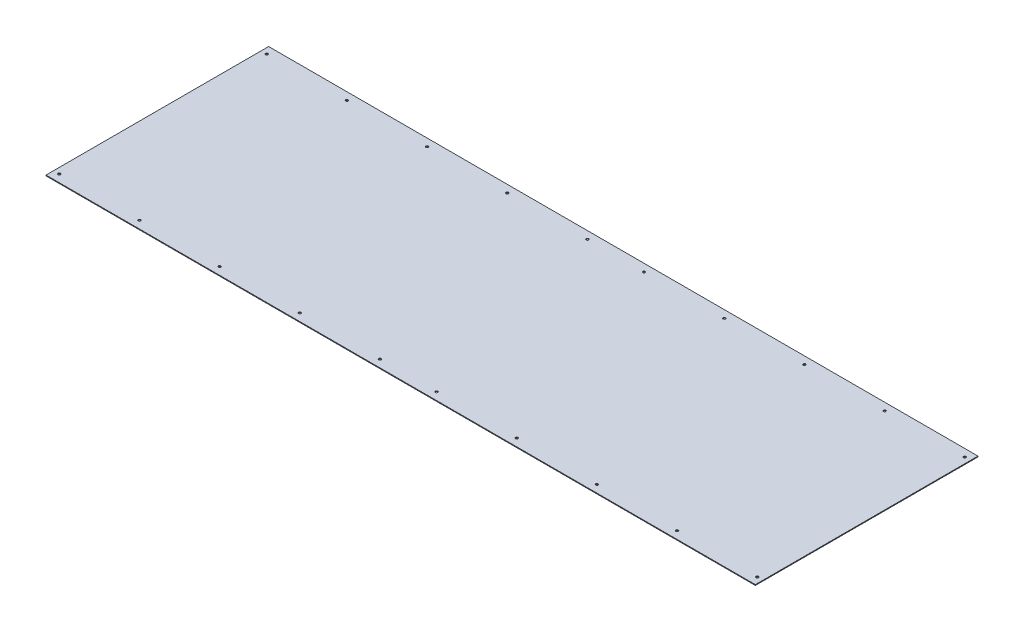
ISO-10303-21;
HEADER;
FILE_DESCRIPTION(('STEP AP214'),'2;1');
FILE_NAME('part.step','',(''),(''),'','','');
FILE_SCHEMA(('AUTOMOTIVE_DESIGN { 1 0 10303 214 1 1 1 1 }'));
ENDSEC;
DATA;
#1=APPLICATION_CONTEXT('core data for automotive mechanical design processes');
#2=APPLICATION_PROTOCOL_DEFINITION('international standard','automotive_design',2000,#1);
#3=PRODUCT_CONTEXT('',#1,'mechanical');
#4=PRODUCT('Part','Part','',(#3));
#5=PRODUCT_RELATED_PRODUCT_CATEGORY('part','',(#4));
#6=PRODUCT_DEFINITION_FORMATION('','',#4);
#7=PRODUCT_DEFINITION_CONTEXT('part definition',#1,'design');
#8=PRODUCT_DEFINITION('design','',#6,#7);
#9=PRODUCT_DEFINITION_SHAPE('','',#8);
#10=(LENGTH_UNIT() NAMED_UNIT(*) SI_UNIT(.MILLI.,.METRE.));
#11=(NAMED_UNIT(*) PLANE_ANGLE_UNIT() SI_UNIT($,.RADIAN.));
#12=(NAMED_UNIT(*) SI_UNIT($,.STERADIAN.) SOLID_ANGLE_UNIT());
#13=UNCERTAINTY_MEASURE_WITH_UNIT(LENGTH_MEASURE(1.E-05),#10,'distance_accuracy_value','');
#14=(GEOMETRIC_REPRESENTATION_CONTEXT(3) GLOBAL_UNCERTAINTY_ASSIGNED_CONTEXT((#13)) GLOBAL_UNIT_ASSIGNED_CONTEXT((#10,
#11,#12)) REPRESENTATION_CONTEXT('',''));
#15=CARTESIAN_POINT('',(0.,0.,0.));
#16=DIRECTION('',(0.,0.,1.));
#17=DIRECTION('',(1.,0.,0.));
#18=AXIS2_PLACEMENT_3D('',#15,#16,#17);
#19=CARTESIAN_POINT('',(-940.,2.,295.));
#20=DIRECTION('',(1.,0.,0.));
#21=DIRECTION('',(0.,0.,-1.));
#22=AXIS2_PLACEMENT_3D('',#19,#20,#21);
#23=PLANE('',#22);
#24=DIRECTION('',(0.,0.,1.));
#25=VECTOR('',#24,1.);
#26=CARTESIAN_POINT('',(-940.,0.,295.));
#27=LINE('',#26,#25);
#28=CARTESIAN_POINT('',(-940.,0.,-295.));
#29=VERTEX_POINT('',#28);
#30=CARTESIAN_POINT('',(-940.,0.,295.));
#31=VERTEX_POINT('',#30);
#32=EDGE_CURVE('E104',#29,#31,#27,.T.);
#33=ORIENTED_EDGE('',*,*,#32,.T.);
#34=DIRECTION('',(0.,-1.,0.));
#35=VECTOR('',#34,1.);
#36=CARTESIAN_POINT('',(-940.,2.,295.));
#37=LINE('',#36,#35);
#38=CARTESIAN_POINT('',(-940.,2.,295.));
#39=VERTEX_POINT('',#38);
#40=EDGE_CURVE('E11',#39,#31,#37,.T.);
#41=ORIENTED_EDGE('',*,*,#40,.F.);
#42=DIRECTION('',(0.,0.,1.));
#43=VECTOR('',#42,1.);
#44=CARTESIAN_POINT('',(-940.,2.,295.));
#45=LINE('',#44,#43);
#46=CARTESIAN_POINT('',(-940.,2.,-295.));
#47=VERTEX_POINT('',#46);
#48=EDGE_CURVE('E91',#47,#39,#45,.T.);
#49=ORIENTED_EDGE('',*,*,#48,.F.);
#50=DIRECTION('',(0.,-1.,0.));
#51=VECTOR('',#50,1.);
#52=CARTESIAN_POINT('',(-940.,2.,-295.));
#53=LINE('',#52,#51);
#54=EDGE_CURVE('E100',#47,#29,#53,.T.);
#55=ORIENTED_EDGE('',*,*,#54,.T.);
#56=EDGE_LOOP('',(#33,#41,#49,#55));
#57=FACE_BOUND('',#56,.T.);
#58=ADVANCED_FACE('F38',(#57),#23,.F.);
#59=CARTESIAN_POINT('',(940.,2.,295.));
#60=DIRECTION('',(0.,0.,-1.));
#61=DIRECTION('',(-1.,0.,0.));
#62=AXIS2_PLACEMENT_3D('',#59,#60,#61);
#63=PLANE('',#62);
#64=DIRECTION('',(1.,0.,0.));
#65=VECTOR('',#64,1.);
#66=CARTESIAN_POINT('',(940.,0.,295.));
#67=LINE('',#66,#65);
#68=CARTESIAN_POINT('',(940.,0.,295.));
#69=VERTEX_POINT('',#68);
#70=EDGE_CURVE('E95',#31,#69,#67,.T.);
#71=ORIENTED_EDGE('',*,*,#70,.T.);
#72=DIRECTION('',(0.,-1.,0.));
#73=VECTOR('',#72,1.);
#74=CARTESIAN_POINT('',(940.,2.,295.));
#75=LINE('',#74,#73);
#76=CARTESIAN_POINT('',(940.,2.,295.));
#77=VERTEX_POINT('',#76);
#78=EDGE_CURVE('E47',#77,#69,#75,.T.);
#79=ORIENTED_EDGE('',*,*,#78,.F.);
#80=DIRECTION('',(1.,0.,0.));
#81=VECTOR('',#80,1.);
#82=CARTESIAN_POINT('',(940.,2.,295.));
#83=LINE('',#82,#81);
#84=EDGE_CURVE('E86',#39,#77,#83,.T.);
#85=ORIENTED_EDGE('',*,*,#84,.F.);
#86=ORIENTED_EDGE('',*,*,#40,.T.);
#87=EDGE_LOOP('',(#71,#79,#85,#86));
#88=FACE_BOUND('',#87,.T.);
#89=ADVANCED_FACE('F94',(#88),#63,.F.);
#90=CARTESIAN_POINT('',(940.,2.,295.));
#91=DIRECTION('',(-1.,0.,0.));
#92=DIRECTION('',(0.,0.,1.));
#93=AXIS2_PLACEMENT_3D('',#90,#91,#92);
#94=PLANE('',#93);
#95=DIRECTION('',(0.,0.,-1.));
#96=VECTOR('',#95,1.);
#97=CARTESIAN_POINT('',(940.,0.,295.));
#98=LINE('',#97,#96);
#99=CARTESIAN_POINT('',(940.,0.,-295.));
#100=VERTEX_POINT('',#99);
#101=EDGE_CURVE('E73',#69,#100,#98,.T.);
#102=ORIENTED_EDGE('',*,*,#101,.T.);
#103=DIRECTION('',(0.,-1.,0.));
#104=VECTOR('',#103,1.);
#105=CARTESIAN_POINT('',(940.,2.,-295.));
#106=LINE('',#105,#104);
#107=CARTESIAN_POINT('',(940.,2.,-295.));
#108=VERTEX_POINT('',#107);
#109=EDGE_CURVE('E96',#108,#100,#106,.T.);
#110=ORIENTED_EDGE('',*,*,#109,.F.);
#111=DIRECTION('',(0.,0.,-1.));
#112=VECTOR('',#111,1.);
#113=CARTESIAN_POINT('',(940.,2.,295.));
#114=LINE('',#113,#112);
#115=EDGE_CURVE('E89',#77,#108,#114,.T.);
#116=ORIENTED_EDGE('',*,*,#115,.F.);
#117=ORIENTED_EDGE('',*,*,#78,.T.);
#118=EDGE_LOOP('',(#102,#110,#116,#117));
#119=FACE_BOUND('',#118,.T.);
#120=ADVANCED_FACE('F98',(#119),#94,.F.);
#121=CARTESIAN_POINT('',(940.,2.,-295.));
#122=DIRECTION('',(0.,0.,1.));
#123=DIRECTION('',(1.,0.,0.));
#124=AXIS2_PLACEMENT_3D('',#121,#122,#123);
#125=PLANE('',#124);
#126=DIRECTION('',(-1.,0.,0.));
#127=VECTOR('',#126,1.);
#128=CARTESIAN_POINT('',(940.,0.,-295.));
#129=LINE('',#128,#127);
#130=EDGE_CURVE('E79',#100,#29,#129,.T.);
#131=ORIENTED_EDGE('',*,*,#130,.T.);
#132=ORIENTED_EDGE('',*,*,#54,.F.);
#133=DIRECTION('',(-1.,0.,0.));
#134=VECTOR('',#133,1.);
#135=CARTESIAN_POINT('',(940.,2.,-295.));
#136=LINE('',#135,#134);
#137=EDGE_CURVE('E56',#108,#47,#136,.T.);
#138=ORIENTED_EDGE('',*,*,#137,.F.);
#139=ORIENTED_EDGE('',*,*,#109,.T.);
#140=EDGE_LOOP('',(#131,#132,#138,#139));
#141=FACE_BOUND('',#140,.T.);
#142=ADVANCED_FACE('F205',(#141),#125,.F.);
#143=CARTESIAN_POINT('',(0.,2.,0.));
#144=DIRECTION('',(0.,1.,0.));
#145=DIRECTION('',(0.,0.,1.));
#146=AXIS2_PLACEMENT_3D('',#143,#144,#145);
#147=PLANE('',#146);
#148=CARTESIAN_POINT('',(712.5,2.,-274.999999999999));
#149=DIRECTION('',(0.,1.,0.));
#150=DIRECTION('',(0.,0.,1.));
#151=AXIS2_PLACEMENT_3D('',#148,#149,#150);
#152=CIRCLE('',#151,3.24999999999995);
#153=CARTESIAN_POINT('',(712.5,2.,-271.749999999999));
#154=VERTEX_POINT('',#153);
#155=EDGE_CURVE('E480',#154,#154,#152,.T.);
#156=ORIENTED_EDGE('',*,*,#155,.F.);
#157=EDGE_LOOP('',(#156));
#158=FACE_BOUND('',#157,.T.);
#159=CARTESIAN_POINT('',(925.,2.,275.));
#160=DIRECTION('',(0.,1.,0.));
#161=DIRECTION('',(0.,0.,1.));
#162=AXIS2_PLACEMENT_3D('',#159,#160,#161);
#163=CIRCLE('',#162,3.24999999999995);
#164=CARTESIAN_POINT('',(925.,2.,278.25));
#165=VERTEX_POINT('',#164);
#166=EDGE_CURVE('E474',#165,#165,#163,.T.);
#167=ORIENTED_EDGE('',*,*,#166,.F.);
#168=EDGE_LOOP('',(#167));
#169=FACE_BOUND('',#168,.T.);
#170=CARTESIAN_POINT('',(925.,2.,-275.));
#171=DIRECTION('',(0.,1.,0.));
#172=DIRECTION('',(0.,0.,1.));
#173=AXIS2_PLACEMENT_3D('',#170,#171,#172);
#174=CIRCLE('',#173,3.24999999999995);
#175=CARTESIAN_POINT('',(925.,2.,-271.75));
#176=VERTEX_POINT('',#175);
#177=EDGE_CURVE('E418',#176,#176,#174,.T.);
#178=ORIENTED_EDGE('',*,*,#177,.F.);
#179=EDGE_LOOP('',(#178));
#180=FACE_BOUND('',#179,.T.);
#181=CARTESIAN_POINT('',(-75.0000000000004,2.,275.));
#182=DIRECTION('',(0.,1.,0.));
#183=DIRECTION('',(0.,0.,1.));
#184=AXIS2_PLACEMENT_3D('',#181,#182,#183);
#185=CIRCLE('',#184,3.24999999999997);
#186=CARTESIAN_POINT('',(-75.0000000000004,2.,278.25));
#187=VERTEX_POINT('',#186);
#188=EDGE_CURVE('E473',#187,#187,#185,.T.);
#189=ORIENTED_EDGE('',*,*,#188,.F.);
#190=EDGE_LOOP('',(#189));
#191=FACE_BOUND('',#190,.T.);
#192=CARTESIAN_POINT('',(287.5,2.,-274.999999999996));
#193=DIRECTION('',(0.,1.,0.));
#194=DIRECTION('',(0.,0.,1.));
#195=AXIS2_PLACEMENT_3D('',#192,#193,#194);
#196=CIRCLE('',#195,3.24999999999995);
#197=CARTESIAN_POINT('',(287.5,2.,-271.749999999996));
#198=VERTEX_POINT('',#197);
#199=EDGE_CURVE('E534',#198,#198,#196,.T.);
#200=ORIENTED_EDGE('',*,*,#199,.F.);
#201=EDGE_LOOP('',(#200));
#202=FACE_BOUND('',#201,.T.);
#203=CARTESIAN_POINT('',(500.,2.,275.000000000003));
#204=DIRECTION('',(0.,1.,0.));
#205=DIRECTION('',(0.,0.,1.));
#206=AXIS2_PLACEMENT_3D('',#203,#204,#205);
#207=CIRCLE('',#206,3.2499999999999);
#208=CARTESIAN_POINT('',(500.,2.,278.250000000003));
#209=VERTEX_POINT('',#208);
#210=EDGE_CURVE('E537',#209,#209,#207,.T.);
#211=ORIENTED_EDGE('',*,*,#210,.F.);
#212=EDGE_LOOP('',(#211));
#213=FACE_BOUND('',#212,.T.);
#214=CARTESIAN_POINT('',(500.,2.,-274.999999999997));
#215=DIRECTION('',(0.,1.,0.));
#216=DIRECTION('',(0.,0.,1.));
#217=AXIS2_PLACEMENT_3D('',#214,#215,#216);
#218=CIRCLE('',#217,3.2499999999999);
#219=CARTESIAN_POINT('',(500.,2.,-271.749999999997));
#220=VERTEX_POINT('',#219);
#221=EDGE_CURVE('E543',#220,#220,#218,.T.);
#222=ORIENTED_EDGE('',*,*,#221,.F.);
#223=EDGE_LOOP('',(#222));
#224=FACE_BOUND('',#223,.T.);
#225=CARTESIAN_POINT('',(712.5,2.,275.000000000002));
#226=DIRECTION('',(0.,1.,0.));
#227=DIRECTION('',(0.,0.,1.));
#228=AXIS2_PLACEMENT_3D('',#225,#226,#227);
#229=CIRCLE('',#228,3.24999999999995);
#230=CARTESIAN_POINT('',(712.5,2.,278.250000000001));
#231=VERTEX_POINT('',#230);
#232=EDGE_CURVE('E545',#231,#231,#229,.T.);
#233=ORIENTED_EDGE('',*,*,#232,.F.);
#234=EDGE_LOOP('',(#233));
#235=FACE_BOUND('',#234,.T.);
#236=CARTESIAN_POINT('',(-500.,2.,-275.));
#237=DIRECTION('',(0.,1.,0.));
#238=DIRECTION('',(0.,0.,1.));
#239=AXIS2_PLACEMENT_3D('',#236,#237,#238);
#240=CIRCLE('',#239,3.24999999999995);
#241=CARTESIAN_POINT('',(-500.,2.,-271.75));
#242=VERTEX_POINT('',#241);
#243=EDGE_CURVE('E493',#242,#242,#240,.T.);
#244=ORIENTED_EDGE('',*,*,#243,.F.);
#245=EDGE_LOOP('',(#244));
#246=FACE_BOUND('',#245,.T.);
#247=CARTESIAN_POINT('',(-712.5,2.,275.));
#248=DIRECTION('',(0.,1.,0.));
#249=DIRECTION('',(0.,0.,1.));
#250=AXIS2_PLACEMENT_3D('',#247,#248,#249);
#251=CIRCLE('',#250,3.24999999999995);
#252=CARTESIAN_POINT('',(-712.5,2.,278.25));
#253=VERTEX_POINT('',#252);
#254=EDGE_CURVE('E496',#253,#253,#251,.T.);
#255=ORIENTED_EDGE('',*,*,#254,.F.);
#256=EDGE_LOOP('',(#255));
#257=FACE_BOUND('',#256,.T.);
#258=CARTESIAN_POINT('',(-712.5,2.,-275.));
#259=DIRECTION('',(0.,1.,0.));
#260=DIRECTION('',(0.,0.,1.));
#261=AXIS2_PLACEMENT_3D('',#258,#259,#260);
#262=CIRCLE('',#261,3.24999999999995);
#263=CARTESIAN_POINT('',(-712.5,2.,-271.75));
#264=VERTEX_POINT('',#263);
#265=EDGE_CURVE('E499',#264,#264,#262,.T.);
#266=ORIENTED_EDGE('',*,*,#265,.F.);
#267=EDGE_LOOP('',(#266));
#268=FACE_BOUND('',#267,.T.);
#269=CARTESIAN_POINT('',(-925.,2.,275.));
#270=DIRECTION('',(0.,1.,0.));
#271=DIRECTION('',(0.,0.,1.));
#272=AXIS2_PLACEMENT_3D('',#269,#270,#271);
#273=CIRCLE('',#272,3.24999999999995);
#274=CARTESIAN_POINT('',(-925.,2.,278.25));
#275=VERTEX_POINT('',#274);
#276=EDGE_CURVE('E502',#275,#275,#273,.T.);
#277=ORIENTED_EDGE('',*,*,#276,.F.);
#278=EDGE_LOOP('',(#277));
#279=FACE_BOUND('',#278,.T.);
#280=CARTESIAN_POINT('',(-75.0000000000004,2.,-275.));
#281=DIRECTION('',(0.,1.,0.));
#282=DIRECTION('',(0.,0.,1.));
#283=AXIS2_PLACEMENT_3D('',#280,#281,#282);
#284=CIRCLE('',#283,3.24999999999997);
#285=CARTESIAN_POINT('',(-75.0000000000004,2.,-271.75));
#286=VERTEX_POINT('',#285);
#287=EDGE_CURVE('E477',#286,#286,#284,.T.);
#288=ORIENTED_EDGE('',*,*,#287,.F.);
#289=EDGE_LOOP('',(#288));
#290=FACE_BOUND('',#289,.T.);
#291=CARTESIAN_POINT('',(-287.5,2.,275.));
#292=DIRECTION('',(0.,1.,0.));
#293=DIRECTION('',(0.,0.,1.));
#294=AXIS2_PLACEMENT_3D('',#291,#292,#293);
#295=CIRCLE('',#294,3.24999999999995);
#296=CARTESIAN_POINT('',(-287.5,2.,278.25));
#297=VERTEX_POINT('',#296);
#298=EDGE_CURVE('E484',#297,#297,#295,.T.);
#299=ORIENTED_EDGE('',*,*,#298,.F.);
#300=EDGE_LOOP('',(#299));
#301=FACE_BOUND('',#300,.T.);
#302=CARTESIAN_POINT('',(-287.5,2.,-275.));
#303=DIRECTION('',(0.,1.,0.));
#304=DIRECTION('',(0.,0.,1.));
#305=AXIS2_PLACEMENT_3D('',#302,#303,#304);
#306=CIRCLE('',#305,3.24999999999995);
#307=CARTESIAN_POINT('',(-287.5,2.,-271.75));
#308=VERTEX_POINT('',#307);
#309=EDGE_CURVE('E487',#308,#308,#306,.T.);
#310=ORIENTED_EDGE('',*,*,#309,.F.);
#311=EDGE_LOOP('',(#310));
#312=FACE_BOUND('',#311,.T.);
#313=CARTESIAN_POINT('',(-500.,2.,275.));
#314=DIRECTION('',(0.,1.,0.));
#315=DIRECTION('',(0.,0.,1.));
#316=AXIS2_PLACEMENT_3D('',#313,#314,#315);
#317=CIRCLE('',#316,3.24999999999995);
#318=CARTESIAN_POINT('',(-500.,2.,278.25));
#319=VERTEX_POINT('',#318);
#320=EDGE_CURVE('E490',#319,#319,#317,.T.);
#321=ORIENTED_EDGE('',*,*,#320,.F.);
#322=EDGE_LOOP('',(#321));
#323=FACE_BOUND('',#322,.T.);
#324=CARTESIAN_POINT('',(75.,2.,275.000000000006));
#325=DIRECTION('',(0.,1.,0.));
#326=DIRECTION('',(0.,0.,1.));
#327=AXIS2_PLACEMENT_3D('',#324,#325,#326);
#328=CIRCLE('',#327,3.24999999999997);
#329=CARTESIAN_POINT('',(75.,2.,278.250000000006));
#330=VERTEX_POINT('',#329);
#331=EDGE_CURVE('E526',#330,#330,#328,.T.);
#332=ORIENTED_EDGE('',*,*,#331,.F.);
#333=EDGE_LOOP('',(#332));
#334=FACE_BOUND('',#333,.T.);
#335=CARTESIAN_POINT('',(74.9999999999998,2.,-274.999999999994));
#336=DIRECTION('',(0.,1.,0.));
#337=DIRECTION('',(0.,0.,1.));
#338=AXIS2_PLACEMENT_3D('',#335,#336,#337);
#339=CIRCLE('',#338,3.24999999999997);
#340=CARTESIAN_POINT('',(74.9999999999998,2.,-271.749999999994));
#341=VERTEX_POINT('',#340);
#342=EDGE_CURVE('E530',#341,#341,#339,.T.);
#343=ORIENTED_EDGE('',*,*,#342,.F.);
#344=EDGE_LOOP('',(#343));
#345=FACE_BOUND('',#344,.T.);
#346=CARTESIAN_POINT('',(287.5,2.,275.000000000004));
#347=DIRECTION('',(0.,1.,0.));
#348=DIRECTION('',(0.,0.,1.));
#349=AXIS2_PLACEMENT_3D('',#346,#347,#348);
#350=CIRCLE('',#349,3.24999999999995);
#351=CARTESIAN_POINT('',(287.5,2.,278.250000000004));
#352=VERTEX_POINT('',#351);
#353=EDGE_CURVE('E533',#352,#352,#350,.T.);
#354=ORIENTED_EDGE('',*,*,#353,.F.);
#355=EDGE_LOOP('',(#354));
#356=FACE_BOUND('',#355,.T.);
#357=CARTESIAN_POINT('',(-925.,2.,-275.));
#358=DIRECTION('',(0.,1.,0.));
#359=DIRECTION('',(0.,0.,1.));
#360=AXIS2_PLACEMENT_3D('',#357,#358,#359);
#361=CIRCLE('',#360,3.24999999999995);
#362=CARTESIAN_POINT('',(-925.,2.,-271.75));
#363=VERTEX_POINT('',#362);
#364=EDGE_CURVE('E116',#363,#363,#361,.T.);
#365=ORIENTED_EDGE('',*,*,#364,.F.);
#366=EDGE_LOOP('',(#365));
#367=FACE_BOUND('',#366,.T.);
#368=ORIENTED_EDGE('',*,*,#48,.T.);
#369=ORIENTED_EDGE('',*,*,#84,.T.);
#370=ORIENTED_EDGE('',*,*,#115,.T.);
#371=ORIENTED_EDGE('',*,*,#137,.T.);
#372=EDGE_LOOP('',(#368,#369,#370,#371));
#373=FACE_BOUND('',#372,.T.);
#374=ADVANCED_FACE('F87',(#158,#169,#180,#191,#202,#213,#224,#235,#246,#257,#268,#279,#290,#301,
#312,#323,#334,#345,#356,#367,#373),#147,.T.);
#375=CARTESIAN_POINT('',(0.,0.,0.));
#376=DIRECTION('',(0.,1.,0.));
#377=DIRECTION('',(0.,0.,1.));
#378=AXIS2_PLACEMENT_3D('',#375,#376,#377);
#379=PLANE('',#378);
#380=CARTESIAN_POINT('',(712.5,0.,-274.999999999999));
#381=DIRECTION('',(0.,1.,0.));
#382=DIRECTION('',(0.,0.,1.));
#383=AXIS2_PLACEMENT_3D('',#380,#381,#382);
#384=CIRCLE('',#383,3.24999999999995);
#385=CARTESIAN_POINT('',(712.5,0.,-271.749999999999));
#386=VERTEX_POINT('',#385);
#387=EDGE_CURVE('E41',#386,#386,#384,.T.);
#388=ORIENTED_EDGE('',*,*,#387,.T.);
#389=EDGE_LOOP('',(#388));
#390=FACE_BOUND('',#389,.T.);
#391=CARTESIAN_POINT('',(925.,0.,275.));
#392=DIRECTION('',(0.,1.,0.));
#393=DIRECTION('',(0.,0.,1.));
#394=AXIS2_PLACEMENT_3D('',#391,#392,#393);
#395=CIRCLE('',#394,3.24999999999995);
#396=CARTESIAN_POINT('',(925.,0.,278.25));
#397=VERTEX_POINT('',#396);
#398=EDGE_CURVE('E166',#397,#397,#395,.T.);
#399=ORIENTED_EDGE('',*,*,#398,.T.);
#400=EDGE_LOOP('',(#399));
#401=FACE_BOUND('',#400,.T.);
#402=CARTESIAN_POINT('',(925.,0.,-275.));
#403=DIRECTION('',(0.,1.,0.));
#404=DIRECTION('',(0.,0.,1.));
#405=AXIS2_PLACEMENT_3D('',#402,#403,#404);
#406=CIRCLE('',#405,3.24999999999995);
#407=CARTESIAN_POINT('',(925.,0.,-271.75));
#408=VERTEX_POINT('',#407);
#409=EDGE_CURVE('E164',#408,#408,#406,.T.);
#410=ORIENTED_EDGE('',*,*,#409,.T.);
#411=EDGE_LOOP('',(#410));
#412=FACE_BOUND('',#411,.T.);
#413=CARTESIAN_POINT('',(-75.0000000000004,0.,275.));
#414=DIRECTION('',(0.,1.,0.));
#415=DIRECTION('',(0.,0.,1.));
#416=AXIS2_PLACEMENT_3D('',#413,#414,#415);
#417=CIRCLE('',#416,3.24999999999997);
#418=CARTESIAN_POINT('',(-75.0000000000004,0.,278.25));
#419=VERTEX_POINT('',#418);
#420=EDGE_CURVE('E161',#419,#419,#417,.T.);
#421=ORIENTED_EDGE('',*,*,#420,.T.);
#422=EDGE_LOOP('',(#421));
#423=FACE_BOUND('',#422,.T.);
#424=CARTESIAN_POINT('',(287.5,0.,-274.999999999996));
#425=DIRECTION('',(0.,1.,0.));
#426=DIRECTION('',(0.,0.,1.));
#427=AXIS2_PLACEMENT_3D('',#424,#425,#426);
#428=CIRCLE('',#427,3.24999999999995);
#429=CARTESIAN_POINT('',(287.5,0.,-271.749999999996));
#430=VERTEX_POINT('',#429);
#431=EDGE_CURVE('E158',#430,#430,#428,.T.);
#432=ORIENTED_EDGE('',*,*,#431,.T.);
#433=EDGE_LOOP('',(#432));
#434=FACE_BOUND('',#433,.T.);
#435=CARTESIAN_POINT('',(500.,0.,275.000000000003));
#436=DIRECTION('',(0.,1.,0.));
#437=DIRECTION('',(0.,0.,1.));
#438=AXIS2_PLACEMENT_3D('',#435,#436,#437);
#439=CIRCLE('',#438,3.2499999999999);
#440=CARTESIAN_POINT('',(500.,0.,278.250000000003));
#441=VERTEX_POINT('',#440);
#442=EDGE_CURVE('E155',#441,#441,#439,.T.);
#443=ORIENTED_EDGE('',*,*,#442,.T.);
#444=EDGE_LOOP('',(#443));
#445=FACE_BOUND('',#444,.T.);
#446=CARTESIAN_POINT('',(500.,0.,-274.999999999997));
#447=DIRECTION('',(0.,1.,0.));
#448=DIRECTION('',(0.,0.,1.));
#449=AXIS2_PLACEMENT_3D('',#446,#447,#448);
#450=CIRCLE('',#449,3.2499999999999);
#451=CARTESIAN_POINT('',(500.,0.,-271.749999999997));
#452=VERTEX_POINT('',#451);
#453=EDGE_CURVE('E152',#452,#452,#450,.T.);
#454=ORIENTED_EDGE('',*,*,#453,.T.);
#455=EDGE_LOOP('',(#454));
#456=FACE_BOUND('',#455,.T.);
#457=CARTESIAN_POINT('',(712.5,0.,275.000000000002));
#458=DIRECTION('',(0.,1.,0.));
#459=DIRECTION('',(0.,0.,1.));
#460=AXIS2_PLACEMENT_3D('',#457,#458,#459);
#461=CIRCLE('',#460,3.24999999999995);
#462=CARTESIAN_POINT('',(712.5,0.,278.250000000001));
#463=VERTEX_POINT('',#462);
#464=EDGE_CURVE('E149',#463,#463,#461,.T.);
#465=ORIENTED_EDGE('',*,*,#464,.T.);
#466=EDGE_LOOP('',(#465));
#467=FACE_BOUND('',#466,.T.);
#468=CARTESIAN_POINT('',(-500.,0.,-275.));
#469=DIRECTION('',(0.,1.,0.));
#470=DIRECTION('',(0.,0.,1.));
#471=AXIS2_PLACEMENT_3D('',#468,#469,#470);
#472=CIRCLE('',#471,3.24999999999995);
#473=CARTESIAN_POINT('',(-500.,0.,-271.75));
#474=VERTEX_POINT('',#473);
#475=EDGE_CURVE('E146',#474,#474,#472,.T.);
#476=ORIENTED_EDGE('',*,*,#475,.T.);
#477=EDGE_LOOP('',(#476));
#478=FACE_BOUND('',#477,.T.);
#479=CARTESIAN_POINT('',(-712.5,0.,275.));
#480=DIRECTION('',(0.,1.,0.));
#481=DIRECTION('',(0.,0.,1.));
#482=AXIS2_PLACEMENT_3D('',#479,#480,#481);
#483=CIRCLE('',#482,3.24999999999995);
#484=CARTESIAN_POINT('',(-712.5,0.,278.25));
#485=VERTEX_POINT('',#484);
#486=EDGE_CURVE('E143',#485,#485,#483,.T.);
#487=ORIENTED_EDGE('',*,*,#486,.T.);
#488=EDGE_LOOP('',(#487));
#489=FACE_BOUND('',#488,.T.);
#490=CARTESIAN_POINT('',(-712.5,0.,-275.));
#491=DIRECTION('',(0.,1.,0.));
#492=DIRECTION('',(0.,0.,1.));
#493=AXIS2_PLACEMENT_3D('',#490,#491,#492);
#494=CIRCLE('',#493,3.24999999999995);
#495=CARTESIAN_POINT('',(-712.5,0.,-271.75));
#496=VERTEX_POINT('',#495);
#497=EDGE_CURVE('E140',#496,#496,#494,.T.);
#498=ORIENTED_EDGE('',*,*,#497,.T.);
#499=EDGE_LOOP('',(#498));
#500=FACE_BOUND('',#499,.T.);
#501=CARTESIAN_POINT('',(-925.,0.,275.));
#502=DIRECTION('',(0.,1.,0.));
#503=DIRECTION('',(0.,0.,1.));
#504=AXIS2_PLACEMENT_3D('',#501,#502,#503);
#505=CIRCLE('',#504,3.24999999999995);
#506=CARTESIAN_POINT('',(-925.,0.,278.25));
#507=VERTEX_POINT('',#506);
#508=EDGE_CURVE('E137',#507,#507,#505,.T.);
#509=ORIENTED_EDGE('',*,*,#508,.T.);
#510=EDGE_LOOP('',(#509));
#511=FACE_BOUND('',#510,.T.);
#512=CARTESIAN_POINT('',(-75.0000000000004,0.,-275.));
#513=DIRECTION('',(0.,1.,0.));
#514=DIRECTION('',(0.,0.,1.));
#515=AXIS2_PLACEMENT_3D('',#512,#513,#514);
#516=CIRCLE('',#515,3.24999999999997);
#517=CARTESIAN_POINT('',(-75.0000000000004,0.,-271.75));
#518=VERTEX_POINT('',#517);
#519=EDGE_CURVE('E134',#518,#518,#516,.T.);
#520=ORIENTED_EDGE('',*,*,#519,.T.);
#521=EDGE_LOOP('',(#520));
#522=FACE_BOUND('',#521,.T.);
#523=CARTESIAN_POINT('',(-287.5,0.,275.));
#524=DIRECTION('',(0.,1.,0.));
#525=DIRECTION('',(0.,0.,1.));
#526=AXIS2_PLACEMENT_3D('',#523,#524,#525);
#527=CIRCLE('',#526,3.24999999999995);
#528=CARTESIAN_POINT('',(-287.5,0.,278.25));
#529=VERTEX_POINT('',#528);
#530=EDGE_CURVE('E131',#529,#529,#527,.T.);
#531=ORIENTED_EDGE('',*,*,#530,.T.);
#532=EDGE_LOOP('',(#531));
#533=FACE_BOUND('',#532,.T.);
#534=CARTESIAN_POINT('',(-287.5,0.,-275.));
#535=DIRECTION('',(0.,1.,0.));
#536=DIRECTION('',(0.,0.,1.));
#537=AXIS2_PLACEMENT_3D('',#534,#535,#536);
#538=CIRCLE('',#537,3.24999999999995);
#539=CARTESIAN_POINT('',(-287.5,0.,-271.75));
#540=VERTEX_POINT('',#539);
#541=EDGE_CURVE('E128',#540,#540,#538,.T.);
#542=ORIENTED_EDGE('',*,*,#541,.T.);
#543=EDGE_LOOP('',(#542));
#544=FACE_BOUND('',#543,.T.);
#545=CARTESIAN_POINT('',(-500.,0.,275.));
#546=DIRECTION('',(0.,1.,0.));
#547=DIRECTION('',(0.,0.,1.));
#548=AXIS2_PLACEMENT_3D('',#545,#546,#547);
#549=CIRCLE('',#548,3.24999999999995);
#550=CARTESIAN_POINT('',(-500.,0.,278.25));
#551=VERTEX_POINT('',#550);
#552=EDGE_CURVE('E125',#551,#551,#549,.T.);
#553=ORIENTED_EDGE('',*,*,#552,.T.);
#554=EDGE_LOOP('',(#553));
#555=FACE_BOUND('',#554,.T.);
#556=CARTESIAN_POINT('',(75.,0.,275.000000000006));
#557=DIRECTION('',(0.,1.,0.));
#558=DIRECTION('',(0.,0.,1.));
#559=AXIS2_PLACEMENT_3D('',#556,#557,#558);
#560=CIRCLE('',#559,3.24999999999997);
#561=CARTESIAN_POINT('',(75.,0.,278.250000000006));
#562=VERTEX_POINT('',#561);
#563=EDGE_CURVE('E122',#562,#562,#560,.T.);
#564=ORIENTED_EDGE('',*,*,#563,.T.);
#565=EDGE_LOOP('',(#564));
#566=FACE_BOUND('',#565,.T.);
#567=CARTESIAN_POINT('',(74.9999999999998,0.,-274.999999999994));
#568=DIRECTION('',(0.,1.,0.));
#569=DIRECTION('',(0.,0.,1.));
#570=AXIS2_PLACEMENT_3D('',#567,#568,#569);
#571=CIRCLE('',#570,3.24999999999997);
#572=CARTESIAN_POINT('',(74.9999999999998,0.,-271.749999999994));
#573=VERTEX_POINT('',#572);
#574=EDGE_CURVE('E119',#573,#573,#571,.T.);
#575=ORIENTED_EDGE('',*,*,#574,.T.);
#576=EDGE_LOOP('',(#575));
#577=FACE_BOUND('',#576,.T.);
#578=CARTESIAN_POINT('',(287.5,0.,275.000000000004));
#579=DIRECTION('',(0.,1.,0.));
#580=DIRECTION('',(0.,0.,1.));
#581=AXIS2_PLACEMENT_3D('',#578,#579,#580);
#582=CIRCLE('',#581,3.24999999999995);
#583=CARTESIAN_POINT('',(287.5,0.,278.250000000004));
#584=VERTEX_POINT('',#583);
#585=EDGE_CURVE('E115',#584,#584,#582,.T.);
#586=ORIENTED_EDGE('',*,*,#585,.T.);
#587=EDGE_LOOP('',(#586));
#588=FACE_BOUND('',#587,.T.);
#589=CARTESIAN_POINT('',(-925.,0.,-275.));
#590=DIRECTION('',(0.,1.,0.));
#591=DIRECTION('',(0.,0.,1.));
#592=AXIS2_PLACEMENT_3D('',#589,#590,#591);
#593=CIRCLE('',#592,3.24999999999995);
#594=CARTESIAN_POINT('',(-925.,0.,-271.75));
#595=VERTEX_POINT('',#594);
#596=EDGE_CURVE('E112',#595,#595,#593,.T.);
#597=ORIENTED_EDGE('',*,*,#596,.T.);
#598=EDGE_LOOP('',(#597));
#599=FACE_BOUND('',#598,.T.);
#600=ORIENTED_EDGE('',*,*,#32,.F.);
#601=ORIENTED_EDGE('',*,*,#130,.F.);
#602=ORIENTED_EDGE('',*,*,#101,.F.);
#603=ORIENTED_EDGE('',*,*,#70,.F.);
#604=EDGE_LOOP('',(#600,#601,#602,#603));
#605=FACE_BOUND('',#604,.T.);
#606=ADVANCED_FACE('F173',(#390,#401,#412,#423,#434,#445,#456,#467,#478,#489,#500,#511,#522,
#533,#544,#555,#566,#577,#588,#599,#605),#379,.F.);
#607=CARTESIAN_POINT('',(-925.,-8.,-275.));
#608=DIRECTION('',(0.,1.,0.));
#609=DIRECTION('',(0.,0.,1.));
#610=AXIS2_PLACEMENT_3D('',#607,#608,#609);
#611=CYLINDRICAL_SURFACE('',#610,3.24999999999995);
#612=ORIENTED_EDGE('',*,*,#364,.T.);
#613=EDGE_LOOP('',(#612));
#614=FACE_BOUND('',#613,.T.);
#615=ORIENTED_EDGE('',*,*,#596,.F.);
#616=EDGE_LOOP('',(#615));
#617=FACE_BOUND('',#616,.T.);
#618=ADVANCED_FACE('F196',(#614,#617),#611,.F.);
#619=CARTESIAN_POINT('',(287.5,-8.,275.000000000004));
#620=DIRECTION('',(0.,1.,0.));
#621=DIRECTION('',(0.,0.,1.));
#622=AXIS2_PLACEMENT_3D('',#619,#620,#621);
#623=CYLINDRICAL_SURFACE('',#622,3.24999999999995);
#624=ORIENTED_EDGE('',*,*,#353,.T.);
#625=EDGE_LOOP('',(#624));
#626=FACE_BOUND('',#625,.T.);
#627=ORIENTED_EDGE('',*,*,#585,.F.);
#628=EDGE_LOOP('',(#627));
#629=FACE_BOUND('',#628,.T.);
#630=ADVANCED_FACE('F202',(#626,#629),#623,.F.);
#631=CARTESIAN_POINT('',(74.9999999999998,-8.,-274.999999999994));
#632=DIRECTION('',(0.,1.,0.));
#633=DIRECTION('',(0.,0.,1.));
#634=AXIS2_PLACEMENT_3D('',#631,#632,#633);
#635=CYLINDRICAL_SURFACE('',#634,3.24999999999997);
#636=ORIENTED_EDGE('',*,*,#342,.T.);
#637=EDGE_LOOP('',(#636));
#638=FACE_BOUND('',#637,.T.);
#639=ORIENTED_EDGE('',*,*,#574,.F.);
#640=EDGE_LOOP('',(#639));
#641=FACE_BOUND('',#640,.T.);
#642=ADVANCED_FACE('F243',(#638,#641),#635,.F.);
#643=CARTESIAN_POINT('',(75.,-8.,275.000000000006));
#644=DIRECTION('',(0.,1.,0.));
#645=DIRECTION('',(0.,0.,1.));
#646=AXIS2_PLACEMENT_3D('',#643,#644,#645);
#647=CYLINDRICAL_SURFACE('',#646,3.24999999999997);
#648=ORIENTED_EDGE('',*,*,#331,.T.);
#649=EDGE_LOOP('',(#648));
#650=FACE_BOUND('',#649,.T.);
#651=ORIENTED_EDGE('',*,*,#563,.F.);
#652=EDGE_LOOP('',(#651));
#653=FACE_BOUND('',#652,.T.);
#654=ADVANCED_FACE('F253',(#650,#653),#647,.F.);
#655=CARTESIAN_POINT('',(-500.,-8.,275.));
#656=DIRECTION('',(0.,1.,0.));
#657=DIRECTION('',(0.,0.,1.));
#658=AXIS2_PLACEMENT_3D('',#655,#656,#657);
#659=CYLINDRICAL_SURFACE('',#658,3.24999999999995);
#660=ORIENTED_EDGE('',*,*,#320,.T.);
#661=EDGE_LOOP('',(#660));
#662=FACE_BOUND('',#661,.T.);
#663=ORIENTED_EDGE('',*,*,#552,.F.);
#664=EDGE_LOOP('',(#663));
#665=FACE_BOUND('',#664,.T.);
#666=ADVANCED_FACE('F263',(#662,#665),#659,.F.);
#667=CARTESIAN_POINT('',(-287.5,-8.,-275.));
#668=DIRECTION('',(0.,1.,0.));
#669=DIRECTION('',(0.,0.,1.));
#670=AXIS2_PLACEMENT_3D('',#667,#668,#669);
#671=CYLINDRICAL_SURFACE('',#670,3.24999999999995);
#672=ORIENTED_EDGE('',*,*,#309,.T.);
#673=EDGE_LOOP('',(#672));
#674=FACE_BOUND('',#673,.T.);
#675=ORIENTED_EDGE('',*,*,#541,.F.);
#676=EDGE_LOOP('',(#675));
#677=FACE_BOUND('',#676,.T.);
#678=ADVANCED_FACE('F273',(#674,#677),#671,.F.);
#679=CARTESIAN_POINT('',(-287.5,-8.,275.));
#680=DIRECTION('',(0.,1.,0.));
#681=DIRECTION('',(0.,0.,1.));
#682=AXIS2_PLACEMENT_3D('',#679,#680,#681);
#683=CYLINDRICAL_SURFACE('',#682,3.24999999999995);
#684=ORIENTED_EDGE('',*,*,#298,.T.);
#685=EDGE_LOOP('',(#684));
#686=FACE_BOUND('',#685,.T.);
#687=ORIENTED_EDGE('',*,*,#530,.F.);
#688=EDGE_LOOP('',(#687));
#689=FACE_BOUND('',#688,.T.);
#690=ADVANCED_FACE('F283',(#686,#689),#683,.F.);
#691=CARTESIAN_POINT('',(-75.0000000000004,-8.,-275.));
#692=DIRECTION('',(0.,1.,0.));
#693=DIRECTION('',(0.,0.,1.));
#694=AXIS2_PLACEMENT_3D('',#691,#692,#693);
#695=CYLINDRICAL_SURFACE('',#694,3.24999999999997);
#696=ORIENTED_EDGE('',*,*,#287,.T.);
#697=EDGE_LOOP('',(#696));
#698=FACE_BOUND('',#697,.T.);
#699=ORIENTED_EDGE('',*,*,#519,.F.);
#700=EDGE_LOOP('',(#699));
#701=FACE_BOUND('',#700,.T.);
#702=ADVANCED_FACE('F293',(#698,#701),#695,.F.);
#703=CARTESIAN_POINT('',(-925.,-8.,275.));
#704=DIRECTION('',(0.,1.,0.));
#705=DIRECTION('',(0.,0.,1.));
#706=AXIS2_PLACEMENT_3D('',#703,#704,#705);
#707=CYLINDRICAL_SURFACE('',#706,3.24999999999995);
#708=ORIENTED_EDGE('',*,*,#276,.T.);
#709=EDGE_LOOP('',(#708));
#710=FACE_BOUND('',#709,.T.);
#711=ORIENTED_EDGE('',*,*,#508,.F.);
#712=EDGE_LOOP('',(#711));
#713=FACE_BOUND('',#712,.T.);
#714=ADVANCED_FACE('F303',(#710,#713),#707,.F.);
#715=CARTESIAN_POINT('',(-712.5,-8.,-275.));
#716=DIRECTION('',(0.,1.,0.));
#717=DIRECTION('',(0.,0.,1.));
#718=AXIS2_PLACEMENT_3D('',#715,#716,#717);
#719=CYLINDRICAL_SURFACE('',#718,3.24999999999995);
#720=ORIENTED_EDGE('',*,*,#265,.T.);
#721=EDGE_LOOP('',(#720));
#722=FACE_BOUND('',#721,.T.);
#723=ORIENTED_EDGE('',*,*,#497,.F.);
#724=EDGE_LOOP('',(#723));
#725=FACE_BOUND('',#724,.T.);
#726=ADVANCED_FACE('F313',(#722,#725),#719,.F.);
#727=CARTESIAN_POINT('',(-712.5,-8.,275.));
#728=DIRECTION('',(0.,1.,0.));
#729=DIRECTION('',(0.,0.,1.));
#730=AXIS2_PLACEMENT_3D('',#727,#728,#729);
#731=CYLINDRICAL_SURFACE('',#730,3.24999999999995);
#732=ORIENTED_EDGE('',*,*,#254,.T.);
#733=EDGE_LOOP('',(#732));
#734=FACE_BOUND('',#733,.T.);
#735=ORIENTED_EDGE('',*,*,#486,.F.);
#736=EDGE_LOOP('',(#735));
#737=FACE_BOUND('',#736,.T.);
#738=ADVANCED_FACE('F323',(#734,#737),#731,.F.);
#739=CARTESIAN_POINT('',(-500.,-8.,-275.));
#740=DIRECTION('',(0.,1.,0.));
#741=DIRECTION('',(0.,0.,1.));
#742=AXIS2_PLACEMENT_3D('',#739,#740,#741);
#743=CYLINDRICAL_SURFACE('',#742,3.24999999999995);
#744=ORIENTED_EDGE('',*,*,#243,.T.);
#745=EDGE_LOOP('',(#744));
#746=FACE_BOUND('',#745,.T.);
#747=ORIENTED_EDGE('',*,*,#475,.F.);
#748=EDGE_LOOP('',(#747));
#749=FACE_BOUND('',#748,.T.);
#750=ADVANCED_FACE('F333',(#746,#749),#743,.F.);
#751=CARTESIAN_POINT('',(712.5,-8.,275.000000000002));
#752=DIRECTION('',(0.,1.,0.));
#753=DIRECTION('',(0.,0.,1.));
#754=AXIS2_PLACEMENT_3D('',#751,#752,#753);
#755=CYLINDRICAL_SURFACE('',#754,3.24999999999995);
#756=ORIENTED_EDGE('',*,*,#232,.T.);
#757=EDGE_LOOP('',(#756));
#758=FACE_BOUND('',#757,.T.);
#759=ORIENTED_EDGE('',*,*,#464,.F.);
#760=EDGE_LOOP('',(#759));
#761=FACE_BOUND('',#760,.T.);
#762=ADVANCED_FACE('F343',(#758,#761),#755,.F.);
#763=CARTESIAN_POINT('',(500.,-8.,-274.999999999997));
#764=DIRECTION('',(0.,1.,0.));
#765=DIRECTION('',(0.,0.,1.));
#766=AXIS2_PLACEMENT_3D('',#763,#764,#765);
#767=CYLINDRICAL_SURFACE('',#766,3.2499999999999);
#768=ORIENTED_EDGE('',*,*,#221,.T.);
#769=EDGE_LOOP('',(#768));
#770=FACE_BOUND('',#769,.T.);
#771=ORIENTED_EDGE('',*,*,#453,.F.);
#772=EDGE_LOOP('',(#771));
#773=FACE_BOUND('',#772,.T.);
#774=ADVANCED_FACE('F353',(#770,#773),#767,.F.);
#775=CARTESIAN_POINT('',(500.,-8.,275.000000000003));
#776=DIRECTION('',(0.,1.,0.));
#777=DIRECTION('',(0.,0.,1.));
#778=AXIS2_PLACEMENT_3D('',#775,#776,#777);
#779=CYLINDRICAL_SURFACE('',#778,3.2499999999999);
#780=ORIENTED_EDGE('',*,*,#210,.T.);
#781=EDGE_LOOP('',(#780));
#782=FACE_BOUND('',#781,.T.);
#783=ORIENTED_EDGE('',*,*,#442,.F.);
#784=EDGE_LOOP('',(#783));
#785=FACE_BOUND('',#784,.T.);
#786=ADVANCED_FACE('F363',(#782,#785),#779,.F.);
#787=CARTESIAN_POINT('',(287.5,-8.,-274.999999999996));
#788=DIRECTION('',(0.,1.,0.));
#789=DIRECTION('',(0.,0.,1.));
#790=AXIS2_PLACEMENT_3D('',#787,#788,#789);
#791=CYLINDRICAL_SURFACE('',#790,3.24999999999995);
#792=ORIENTED_EDGE('',*,*,#199,.T.);
#793=EDGE_LOOP('',(#792));
#794=FACE_BOUND('',#793,.T.);
#795=ORIENTED_EDGE('',*,*,#431,.F.);
#796=EDGE_LOOP('',(#795));
#797=FACE_BOUND('',#796,.T.);
#798=ADVANCED_FACE('F373',(#794,#797),#791,.F.);
#799=CARTESIAN_POINT('',(-75.0000000000004,-8.,275.));
#800=DIRECTION('',(0.,1.,0.));
#801=DIRECTION('',(0.,0.,1.));
#802=AXIS2_PLACEMENT_3D('',#799,#800,#801);
#803=CYLINDRICAL_SURFACE('',#802,3.24999999999997);
#804=ORIENTED_EDGE('',*,*,#188,.T.);
#805=EDGE_LOOP('',(#804));
#806=FACE_BOUND('',#805,.T.);
#807=ORIENTED_EDGE('',*,*,#420,.F.);
#808=EDGE_LOOP('',(#807));
#809=FACE_BOUND('',#808,.T.);
#810=ADVANCED_FACE('F383',(#806,#809),#803,.F.);
#811=CARTESIAN_POINT('',(925.,-8.,-275.));
#812=DIRECTION('',(0.,1.,0.));
#813=DIRECTION('',(0.,0.,1.));
#814=AXIS2_PLACEMENT_3D('',#811,#812,#813);
#815=CYLINDRICAL_SURFACE('',#814,3.24999999999995);
#816=ORIENTED_EDGE('',*,*,#177,.T.);
#817=EDGE_LOOP('',(#816));
#818=FACE_BOUND('',#817,.T.);
#819=ORIENTED_EDGE('',*,*,#409,.F.);
#820=EDGE_LOOP('',(#819));
#821=FACE_BOUND('',#820,.T.);
#822=ADVANCED_FACE('F183',(#818,#821),#815,.F.);
#823=CARTESIAN_POINT('',(925.,-8.,275.));
#824=DIRECTION('',(0.,1.,0.));
#825=DIRECTION('',(0.,0.,1.));
#826=AXIS2_PLACEMENT_3D('',#823,#824,#825);
#827=CYLINDRICAL_SURFACE('',#826,3.24999999999995);
#828=ORIENTED_EDGE('',*,*,#166,.T.);
#829=EDGE_LOOP('',(#828));
#830=FACE_BOUND('',#829,.T.);
#831=ORIENTED_EDGE('',*,*,#398,.F.);
#832=EDGE_LOOP('',(#831));
#833=FACE_BOUND('',#832,.T.);
#834=ADVANCED_FACE('F177',(#830,#833),#827,.F.);
#835=CARTESIAN_POINT('',(712.5,-8.,-274.999999999999));
#836=DIRECTION('',(0.,1.,0.));
#837=DIRECTION('',(0.,0.,1.));
#838=AXIS2_PLACEMENT_3D('',#835,#836,#837);
#839=CYLINDRICAL_SURFACE('',#838,3.24999999999995);
#840=ORIENTED_EDGE('',*,*,#155,.T.);
#841=EDGE_LOOP('',(#840));
#842=FACE_BOUND('',#841,.T.);
#843=ORIENTED_EDGE('',*,*,#387,.F.);
#844=EDGE_LOOP('',(#843));
#845=FACE_BOUND('',#844,.T.);
#846=ADVANCED_FACE('F175',(#842,#845),#839,.F.);
#847=CLOSED_SHELL('',(#58,#89,#120,#142,#374,#606,#618,#630,#642,#654,#666,#678,#690,#702,#714,
#726,#738,#750,#762,#774,#786,#798,#810,#822,#834,#846));
#848=MANIFOLD_SOLID_BREP('B2',#847);
#849=ADVANCED_BREP_SHAPE_REPRESENTATION('',(#18,#848),#14);
#850=SHAPE_DEFINITION_REPRESENTATION(#9,#849);
ENDSEC;
END-ISO-10303-21;
